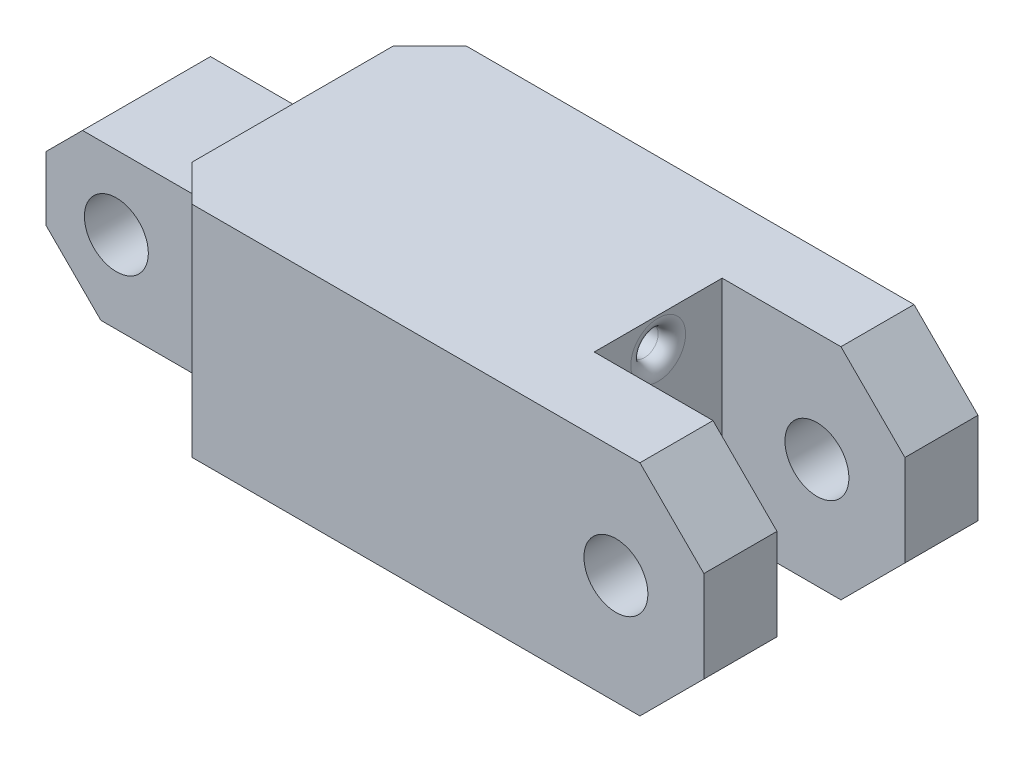
ISO-10303-21;
HEADER;
FILE_DESCRIPTION(('STEP AP214'),'2;1');
FILE_NAME('part.step','',(''),(''),'','','');
FILE_SCHEMA(('AUTOMOTIVE_DESIGN { 1 0 10303 214 1 1 1 1 }'));
ENDSEC;
DATA;
#1=APPLICATION_CONTEXT('core data for automotive mechanical design processes');
#2=APPLICATION_PROTOCOL_DEFINITION('international standard','automotive_design',2000,#1);
#3=PRODUCT_CONTEXT('',#1,'mechanical');
#4=PRODUCT('Part','Part','',(#3));
#5=PRODUCT_RELATED_PRODUCT_CATEGORY('part','',(#4));
#6=PRODUCT_DEFINITION_FORMATION('','',#4);
#7=PRODUCT_DEFINITION_CONTEXT('part definition',#1,'design');
#8=PRODUCT_DEFINITION('design','',#6,#7);
#9=PRODUCT_DEFINITION_SHAPE('','',#8);
#10=(LENGTH_UNIT() NAMED_UNIT(*) SI_UNIT(.MILLI.,.METRE.));
#11=(NAMED_UNIT(*) PLANE_ANGLE_UNIT() SI_UNIT($,.RADIAN.));
#12=(NAMED_UNIT(*) SI_UNIT($,.STERADIAN.) SOLID_ANGLE_UNIT());
#13=UNCERTAINTY_MEASURE_WITH_UNIT(LENGTH_MEASURE(1.E-05),#10,'distance_accuracy_value','');
#14=(GEOMETRIC_REPRESENTATION_CONTEXT(3) GLOBAL_UNCERTAINTY_ASSIGNED_CONTEXT((#13)) GLOBAL_UNIT_ASSIGNED_CONTEXT((#10,
#11,#12)) REPRESENTATION_CONTEXT('',''));
#15=CARTESIAN_POINT('',(0.,0.,0.));
#16=DIRECTION('',(0.,0.,1.));
#17=DIRECTION('',(1.,0.,0.));
#18=AXIS2_PLACEMENT_3D('',#15,#16,#17);
#19=CARTESIAN_POINT('',(40.,6.,7.5));
#20=DIRECTION('',(0.,-1.,0.));
#21=DIRECTION('',(0.,0.,-1.));
#22=AXIS2_PLACEMENT_3D('',#19,#20,#21);
#23=PLANE('',#22);
#24=DIRECTION('',(-1.,0.,0.));
#25=VECTOR('',#24,1.);
#26=CARTESIAN_POINT('',(40.,6.,-7.5));
#27=LINE('',#26,#25);
#28=CARTESIAN_POINT('',(36.5,6.,-7.5));
#29=VERTEX_POINT('',#28);
#30=CARTESIAN_POINT('',(12.,6.,-7.5));
#31=VERTEX_POINT('',#30);
#32=EDGE_CURVE('E216',#29,#31,#27,.T.);
#33=ORIENTED_EDGE('',*,*,#32,.T.);
#34=DIRECTION('',(0.707106781186547,0.,-0.707106781186548));
#35=VECTOR('',#34,1.);
#36=CARTESIAN_POINT('',(12.,6.,-7.5));
#37=LINE('',#36,#35);
#38=CARTESIAN_POINT('',(10.,6.,-5.49999999999999));
#39=VERTEX_POINT('',#38);
#40=EDGE_CURVE('E305',#31,#39,#37,.F.);
#41=ORIENTED_EDGE('',*,*,#40,.T.);
#42=DIRECTION('',(0.,0.,-1.));
#43=VECTOR('',#42,1.);
#44=CARTESIAN_POINT('',(10.,6.,-9.96125126915484));
#45=LINE('',#44,#43);
#46=CARTESIAN_POINT('',(10.,6.,5.49999999999999));
#47=VERTEX_POINT('',#46);
#48=EDGE_CURVE('E203',#47,#39,#45,.T.);
#49=ORIENTED_EDGE('',*,*,#48,.F.);
#50=DIRECTION('',(-0.707106781186546,0.,-0.707106781186549));
#51=VECTOR('',#50,1.);
#52=CARTESIAN_POINT('',(12.,6.,7.5));
#53=LINE('',#52,#51);
#54=CARTESIAN_POINT('',(12.,6.,7.5));
#55=VERTEX_POINT('',#54);
#56=EDGE_CURVE('E303',#47,#55,#53,.F.);
#57=ORIENTED_EDGE('',*,*,#56,.T.);
#58=DIRECTION('',(-1.,0.,0.));
#59=VECTOR('',#58,1.);
#60=CARTESIAN_POINT('',(40.,6.,7.5));
#61=LINE('',#60,#59);
#62=CARTESIAN_POINT('',(36.5,6.,7.5));
#63=VERTEX_POINT('',#62);
#64=EDGE_CURVE('E213',#63,#55,#61,.T.);
#65=ORIENTED_EDGE('',*,*,#64,.F.);
#66=DIRECTION('',(0.,0.,-1.));
#67=VECTOR('',#66,1.);
#68=CARTESIAN_POINT('',(36.5,6.,3.5));
#69=LINE('',#68,#67);
#70=CARTESIAN_POINT('',(36.5,6.,3.5));
#71=VERTEX_POINT('',#70);
#72=EDGE_CURVE('E262',#63,#71,#69,.T.);
#73=ORIENTED_EDGE('',*,*,#72,.T.);
#74=DIRECTION('',(1.,0.,0.));
#75=VECTOR('',#74,1.);
#76=CARTESIAN_POINT('',(30.,6.,3.5));
#77=LINE('',#76,#75);
#78=CARTESIAN_POINT('',(30.,6.,3.5));
#79=VERTEX_POINT('',#78);
#80=EDGE_CURVE('E349',#79,#71,#77,.T.);
#81=ORIENTED_EDGE('',*,*,#80,.F.);
#82=DIRECTION('',(0.,0.,1.));
#83=VECTOR('',#82,1.);
#84=CARTESIAN_POINT('',(30.,6.,-3.50000000000001));
#85=LINE('',#84,#83);
#86=CARTESIAN_POINT('',(30.,6.,-3.50000000000001));
#87=VERTEX_POINT('',#86);
#88=EDGE_CURVE('E353',#87,#79,#85,.T.);
#89=ORIENTED_EDGE('',*,*,#88,.F.);
#90=DIRECTION('',(-1.,0.,0.));
#91=VECTOR('',#90,1.);
#92=CARTESIAN_POINT('',(30.,6.,-3.50000000000001));
#93=LINE('',#92,#91);
#94=CARTESIAN_POINT('',(36.5,6.,-3.50000000000002));
#95=VERTEX_POINT('',#94);
#96=EDGE_CURVE('E182',#95,#87,#93,.T.);
#97=ORIENTED_EDGE('',*,*,#96,.F.);
#98=DIRECTION('',(0.,0.,-1.));
#99=VECTOR('',#98,1.);
#100=CARTESIAN_POINT('',(36.5,6.,-7.5));
#101=LINE('',#100,#99);
#102=EDGE_CURVE('E264',#95,#29,#101,.T.);
#103=ORIENTED_EDGE('',*,*,#102,.T.);
#104=EDGE_LOOP('',(#33,#41,#49,#57,#65,#73,#81,#89,#97,#103));
#105=FACE_BOUND('',#104,.T.);
#106=ADVANCED_FACE('F31',(#105),#23,.F.);
#107=CARTESIAN_POINT('',(0.,4.35769332315772,0.));
#108=DIRECTION('',(1.,0.,0.));
#109=DIRECTION('',(0.,0.,-1.));
#110=AXIS2_PLACEMENT_3D('',#107,#108,#109);
#111=CYLINDRICAL_SURFACE('',#110,0.75);
#112=CARTESIAN_POINT('',(29.25,4.35769332315772,0.));
#113=DIRECTION('',(-1.,0.,0.));
#114=DIRECTION('',(0.,0.,1.));
#115=AXIS2_PLACEMENT_3D('',#112,#113,#114);
#116=CIRCLE('',#115,0.75);
#117=CARTESIAN_POINT('',(29.25,4.35769332315772,0.749999999999999));
#118=VERTEX_POINT('',#117);
#119=EDGE_CURVE('E291',#118,#118,#116,.F.);
#120=ORIENTED_EDGE('',*,*,#119,.T.);
#121=EDGE_LOOP('',(#120));
#122=FACE_BOUND('',#121,.T.);
#123=CARTESIAN_POINT('',(10.75,4.35769332315772,0.));
#124=DIRECTION('',(1.,0.,0.));
#125=DIRECTION('',(0.,0.,-1.));
#126=AXIS2_PLACEMENT_3D('',#123,#124,#125);
#127=CIRCLE('',#126,0.75);
#128=CARTESIAN_POINT('',(10.75,4.35769332315772,-0.750000000000001));
#129=VERTEX_POINT('',#128);
#130=EDGE_CURVE('E284',#129,#129,#127,.F.);
#131=ORIENTED_EDGE('',*,*,#130,.T.);
#132=EDGE_LOOP('',(#131));
#133=FACE_BOUND('',#132,.T.);
#134=ADVANCED_FACE('F446',(#122,#133),#111,.F.);
#135=CARTESIAN_POINT('',(40.,-6.,-7.5));
#136=DIRECTION('',(1.,0.,0.));
#137=DIRECTION('',(0.,0.,-1.));
#138=AXIS2_PLACEMENT_3D('',#135,#136,#137);
#139=PLANE('',#138);
#140=DIRECTION('',(0.,-1.,0.));
#141=VECTOR('',#140,1.);
#142=CARTESIAN_POINT('',(40.,6.,7.5));
#143=LINE('',#142,#141);
#144=CARTESIAN_POINT('',(40.,2.49999999999999,7.5));
#145=VERTEX_POINT('',#144);
#146=CARTESIAN_POINT('',(40.,-2.5,7.5));
#147=VERTEX_POINT('',#146);
#148=EDGE_CURVE('E198',#145,#147,#143,.T.);
#149=ORIENTED_EDGE('',*,*,#148,.T.);
#150=DIRECTION('',(0.,0.,-1.));
#151=VECTOR('',#150,1.);
#152=CARTESIAN_POINT('',(40.,-2.5,3.5));
#153=LINE('',#152,#151);
#154=CARTESIAN_POINT('',(40.,-2.5,3.5));
#155=VERTEX_POINT('',#154);
#156=EDGE_CURVE('E251',#147,#155,#153,.T.);
#157=ORIENTED_EDGE('',*,*,#156,.T.);
#158=DIRECTION('',(0.,-1.,0.));
#159=VECTOR('',#158,1.);
#160=CARTESIAN_POINT('',(40.,-6.,3.5));
#161=LINE('',#160,#159);
#162=CARTESIAN_POINT('',(40.,2.49999999999999,3.5));
#163=VERTEX_POINT('',#162);
#164=EDGE_CURVE('E227',#163,#155,#161,.T.);
#165=ORIENTED_EDGE('',*,*,#164,.F.);
#166=DIRECTION('',(0.,0.,1.));
#167=VECTOR('',#166,1.);
#168=CARTESIAN_POINT('',(40.,2.49999999999999,7.5));
#169=LINE('',#168,#167);
#170=EDGE_CURVE('E248',#163,#145,#169,.T.);
#171=ORIENTED_EDGE('',*,*,#170,.T.);
#172=EDGE_LOOP('',(#149,#157,#165,#171));
#173=FACE_BOUND('',#172,.T.);
#174=ADVANCED_FACE('F416',(#173),#139,.T.);
#175=CARTESIAN_POINT('',(40.,6.,-7.5));
#176=DIRECTION('',(0.,0.,1.));
#177=DIRECTION('',(0.,-1.,0.));
#178=AXIS2_PLACEMENT_3D('',#175,#176,#177);
#179=PLANE('',#178);
#180=CARTESIAN_POINT('',(35.1857246316315,0.,-7.5));
#181=DIRECTION('',(0.,0.,1.));
#182=DIRECTION('',(1.,0.,0.));
#183=AXIS2_PLACEMENT_3D('',#180,#181,#182);
#184=CIRCLE('',#183,1.75);
#185=CARTESIAN_POINT('',(36.9357246316315,0.,-7.5));
#186=VERTEX_POINT('',#185);
#187=EDGE_CURVE('E288',#186,#186,#184,.T.);
#188=ORIENTED_EDGE('',*,*,#187,.T.);
#189=EDGE_LOOP('',(#188));
#190=FACE_BOUND('',#189,.T.);
#191=DIRECTION('',(-1.,0.,0.));
#192=VECTOR('',#191,1.);
#193=CARTESIAN_POINT('',(40.,-6.,-7.5));
#194=LINE('',#193,#192);
#195=CARTESIAN_POINT('',(36.5,-6.,-7.5));
#196=VERTEX_POINT('',#195);
#197=CARTESIAN_POINT('',(12.,-6.,-7.50000000000001));
#198=VERTEX_POINT('',#197);
#199=EDGE_CURVE('E207',#196,#198,#194,.T.);
#200=ORIENTED_EDGE('',*,*,#199,.T.);
#201=DIRECTION('',(0.,1.,0.));
#202=VECTOR('',#201,1.);
#203=CARTESIAN_POINT('',(12.,6.,-7.5));
#204=LINE('',#203,#202);
#205=EDGE_CURVE('E300',#198,#31,#204,.T.);
#206=ORIENTED_EDGE('',*,*,#205,.T.);
#207=ORIENTED_EDGE('',*,*,#32,.F.);
#208=DIRECTION('',(0.707106781186548,-0.707106781186547,0.));
#209=VECTOR('',#208,1.);
#210=CARTESIAN_POINT('',(40.,2.49999999999999,-7.5));
#211=LINE('',#210,#209);
#212=CARTESIAN_POINT('',(40.,2.49999999999999,-7.5));
#213=VERTEX_POINT('',#212);
#214=EDGE_CURVE('E236',#29,#213,#211,.T.);
#215=ORIENTED_EDGE('',*,*,#214,.T.);
#216=DIRECTION('',(0.,1.,0.));
#217=VECTOR('',#216,1.);
#218=CARTESIAN_POINT('',(40.,6.,-7.5));
#219=LINE('',#218,#217);
#220=CARTESIAN_POINT('',(40.,-2.5,-7.5));
#221=VERTEX_POINT('',#220);
#222=EDGE_CURVE('E195',#221,#213,#219,.T.);
#223=ORIENTED_EDGE('',*,*,#222,.F.);
#224=DIRECTION('',(-0.707106781186548,-0.707106781186547,0.));
#225=VECTOR('',#224,1.);
#226=CARTESIAN_POINT('',(40.,-2.5,-7.5));
#227=LINE('',#226,#225);
#228=EDGE_CURVE('E238',#221,#196,#227,.T.);
#229=ORIENTED_EDGE('',*,*,#228,.T.);
#230=EDGE_LOOP('',(#200,#206,#207,#215,#223,#229));
#231=FACE_BOUND('',#230,.T.);
#232=ADVANCED_FACE('F318',(#190,#231),#179,.F.);
#233=CARTESIAN_POINT('',(40.,6.,7.5));
#234=DIRECTION('',(0.,0.,-1.));
#235=DIRECTION('',(0.,1.,0.));
#236=AXIS2_PLACEMENT_3D('',#233,#234,#235);
#237=PLANE('',#236);
#238=CARTESIAN_POINT('',(35.1857246316315,0.,7.5));
#239=DIRECTION('',(0.,0.,1.));
#240=DIRECTION('',(1.,0.,0.));
#241=AXIS2_PLACEMENT_3D('',#238,#239,#240);
#242=CIRCLE('',#241,1.75);
#243=CARTESIAN_POINT('',(36.9357246316315,0.,7.5));
#244=VERTEX_POINT('',#243);
#245=EDGE_CURVE('E365',#244,#244,#242,.T.);
#246=ORIENTED_EDGE('',*,*,#245,.F.);
#247=EDGE_LOOP('',(#246));
#248=FACE_BOUND('',#247,.T.);
#249=ORIENTED_EDGE('',*,*,#64,.T.);
#250=DIRECTION('',(0.,-1.,0.));
#251=VECTOR('',#250,1.);
#252=CARTESIAN_POINT('',(12.,6.,7.5));
#253=LINE('',#252,#251);
#254=CARTESIAN_POINT('',(12.,-6.,7.5));
#255=VERTEX_POINT('',#254);
#256=EDGE_CURVE('E11',#55,#255,#253,.T.);
#257=ORIENTED_EDGE('',*,*,#256,.T.);
#258=DIRECTION('',(-1.,0.,0.));
#259=VECTOR('',#258,1.);
#260=CARTESIAN_POINT('',(40.,-6.,7.5));
#261=LINE('',#260,#259);
#262=CARTESIAN_POINT('',(36.5,-6.,7.5));
#263=VERTEX_POINT('',#262);
#264=EDGE_CURVE('E210',#263,#255,#261,.T.);
#265=ORIENTED_EDGE('',*,*,#264,.F.);
#266=DIRECTION('',(0.707106781186548,0.707106781186547,0.));
#267=VECTOR('',#266,1.);
#268=CARTESIAN_POINT('',(40.,-2.5,7.5));
#269=LINE('',#268,#267);
#270=EDGE_CURVE('E260',#263,#147,#269,.T.);
#271=ORIENTED_EDGE('',*,*,#270,.T.);
#272=ORIENTED_EDGE('',*,*,#148,.F.);
#273=DIRECTION('',(-0.707106781186548,0.707106781186547,0.));
#274=VECTOR('',#273,1.);
#275=CARTESIAN_POINT('',(40.,2.49999999999999,7.5));
#276=LINE('',#275,#274);
#277=EDGE_CURVE('E258',#145,#63,#276,.T.);
#278=ORIENTED_EDGE('',*,*,#277,.T.);
#279=EDGE_LOOP('',(#249,#257,#265,#271,#272,#278));
#280=FACE_BOUND('',#279,.T.);
#281=ADVANCED_FACE('F414',(#248,#280),#237,.F.);
#282=CARTESIAN_POINT('',(40.,-6.,7.5));
#283=DIRECTION('',(0.,1.,0.));
#284=DIRECTION('',(0.,0.,1.));
#285=AXIS2_PLACEMENT_3D('',#282,#283,#284);
#286=PLANE('',#285);
#287=DIRECTION('',(0.,0.,-1.));
#288=VECTOR('',#287,1.);
#289=CARTESIAN_POINT('',(10.,-6.,-9.96125126915484));
#290=LINE('',#289,#288);
#291=CARTESIAN_POINT('',(10.,-6.,-3.5));
#292=VERTEX_POINT('',#291);
#293=CARTESIAN_POINT('',(10.,-6.,-5.49999999999999));
#294=VERTEX_POINT('',#293);
#295=EDGE_CURVE('E194',#292,#294,#290,.T.);
#296=ORIENTED_EDGE('',*,*,#295,.T.);
#297=DIRECTION('',(-0.707106781186547,0.,0.707106781186548));
#298=VECTOR('',#297,1.);
#299=CARTESIAN_POINT('',(12.,-6.,-7.5));
#300=LINE('',#299,#298);
#301=EDGE_CURVE('E39',#294,#198,#300,.F.);
#302=ORIENTED_EDGE('',*,*,#301,.T.);
#303=ORIENTED_EDGE('',*,*,#199,.F.);
#304=DIRECTION('',(0.,0.,1.));
#305=VECTOR('',#304,1.);
#306=CARTESIAN_POINT('',(36.5,-6.,-3.50000000000002));
#307=LINE('',#306,#305);
#308=CARTESIAN_POINT('',(36.5,-6.,-3.50000000000002));
#309=VERTEX_POINT('',#308);
#310=EDGE_CURVE('E242',#196,#309,#307,.T.);
#311=ORIENTED_EDGE('',*,*,#310,.T.);
#312=DIRECTION('',(-1.,0.,0.));
#313=VECTOR('',#312,1.);
#314=CARTESIAN_POINT('',(30.,-6.,-3.50000000000001));
#315=LINE('',#314,#313);
#316=CARTESIAN_POINT('',(30.,-6.,-3.50000000000001));
#317=VERTEX_POINT('',#316);
#318=EDGE_CURVE('E352',#309,#317,#315,.T.);
#319=ORIENTED_EDGE('',*,*,#318,.T.);
#320=DIRECTION('',(0.,0.,1.));
#321=VECTOR('',#320,1.);
#322=CARTESIAN_POINT('',(30.,-6.,-3.50000000000001));
#323=LINE('',#322,#321);
#324=CARTESIAN_POINT('',(30.,-6.,3.5));
#325=VERTEX_POINT('',#324);
#326=EDGE_CURVE('E359',#317,#325,#323,.T.);
#327=ORIENTED_EDGE('',*,*,#326,.T.);
#328=DIRECTION('',(1.,0.,0.));
#329=VECTOR('',#328,1.);
#330=CARTESIAN_POINT('',(30.,-6.,3.5));
#331=LINE('',#330,#329);
#332=CARTESIAN_POINT('',(36.5,-6.,3.5));
#333=VERTEX_POINT('',#332);
#334=EDGE_CURVE('E347',#325,#333,#331,.T.);
#335=ORIENTED_EDGE('',*,*,#334,.T.);
#336=DIRECTION('',(0.,0.,1.));
#337=VECTOR('',#336,1.);
#338=CARTESIAN_POINT('',(36.5,-6.,7.5));
#339=LINE('',#338,#337);
#340=EDGE_CURVE('E240',#333,#263,#339,.T.);
#341=ORIENTED_EDGE('',*,*,#340,.T.);
#342=ORIENTED_EDGE('',*,*,#264,.T.);
#343=DIRECTION('',(0.707106781186546,0.,0.707106781186549));
#344=VECTOR('',#343,1.);
#345=CARTESIAN_POINT('',(12.,-6.,7.5));
#346=LINE('',#345,#344);
#347=CARTESIAN_POINT('',(10.,-6.,5.49999999999999));
#348=VERTEX_POINT('',#347);
#349=EDGE_CURVE('E46',#255,#348,#346,.F.);
#350=ORIENTED_EDGE('',*,*,#349,.T.);
#351=DIRECTION('',(0.,0.,-1.));
#352=VECTOR('',#351,1.);
#353=CARTESIAN_POINT('',(10.,-6.,9.96125126915484));
#354=LINE('',#353,#352);
#355=CARTESIAN_POINT('',(10.,-6.,3.5));
#356=VERTEX_POINT('',#355);
#357=EDGE_CURVE('E333',#348,#356,#354,.T.);
#358=ORIENTED_EDGE('',*,*,#357,.T.);
#359=DIRECTION('',(-1.,0.,0.));
#360=VECTOR('',#359,1.);
#361=CARTESIAN_POINT('',(-3.34504973201027,-6.,3.5));
#362=LINE('',#361,#360);
#363=CARTESIAN_POINT('',(3.00000000000001,-6.,3.5));
#364=VERTEX_POINT('',#363);
#365=EDGE_CURVE('E328',#356,#364,#362,.T.);
#366=ORIENTED_EDGE('',*,*,#365,.T.);
#367=DIRECTION('',(0.,0.,-1.));
#368=VECTOR('',#367,1.);
#369=CARTESIAN_POINT('',(3.00000000000001,-6.,7.5));
#370=LINE('',#369,#368);
#371=CARTESIAN_POINT('',(3.00000000000001,-6.,-3.5));
#372=VERTEX_POINT('',#371);
#373=EDGE_CURVE('E266',#364,#372,#370,.T.);
#374=ORIENTED_EDGE('',*,*,#373,.T.);
#375=DIRECTION('',(1.,0.,0.));
#376=VECTOR('',#375,1.);
#377=CARTESIAN_POINT('',(-3.34504973201027,-6.,-3.5));
#378=LINE('',#377,#376);
#379=EDGE_CURVE('E200',#372,#292,#378,.T.);
#380=ORIENTED_EDGE('',*,*,#379,.T.);
#381=EDGE_LOOP('',(#296,#302,#303,#311,#319,#327,#335,#341,#342,#350,#358,#366,#374,#380));
#382=FACE_BOUND('',#381,.T.);
#383=ADVANCED_FACE('F313',(#382),#286,.F.);
#384=DIRECTION('',(0.,1.,0.));
#385=VECTOR('',#384,1.);
#386=CARTESIAN_POINT('',(40.,-6.,-3.50000000000002));
#387=LINE('',#386,#385);
#388=CARTESIAN_POINT('',(40.,-2.5,-3.50000000000002));
#389=VERTEX_POINT('',#388);
#390=CARTESIAN_POINT('',(40.,2.49999999999999,-3.50000000000002));
#391=VERTEX_POINT('',#390);
#392=EDGE_CURVE('E224',#389,#391,#387,.T.);
#393=ORIENTED_EDGE('',*,*,#392,.F.);
#394=DIRECTION('',(0.,0.,-1.));
#395=VECTOR('',#394,1.);
#396=CARTESIAN_POINT('',(40.,-2.5,-7.5));
#397=LINE('',#396,#395);
#398=EDGE_CURVE('E233',#389,#221,#397,.T.);
#399=ORIENTED_EDGE('',*,*,#398,.T.);
#400=ORIENTED_EDGE('',*,*,#222,.T.);
#401=DIRECTION('',(0.,0.,1.));
#402=VECTOR('',#401,1.);
#403=CARTESIAN_POINT('',(40.,2.49999999999999,-3.50000000000002));
#404=LINE('',#403,#402);
#405=EDGE_CURVE('E230',#213,#391,#404,.T.);
#406=ORIENTED_EDGE('',*,*,#405,.T.);
#407=EDGE_LOOP('',(#393,#399,#400,#406));
#408=FACE_BOUND('',#407,.T.);
#409=ADVANCED_FACE('F394',(#408),#139,.T.);
#410=CARTESIAN_POINT('',(0.,-6.,-7.5));
#411=DIRECTION('',(1.,0.,0.));
#412=DIRECTION('',(0.,0.,-1.));
#413=AXIS2_PLACEMENT_3D('',#410,#411,#412);
#414=PLANE('',#413);
#415=DIRECTION('',(0.,1.,0.));
#416=VECTOR('',#415,1.);
#417=CARTESIAN_POINT('',(0.,-6.,3.5));
#418=LINE('',#417,#416);
#419=CARTESIAN_POINT('',(0.,-2.99999999999999,3.5));
#420=VERTEX_POINT('',#419);
#421=CARTESIAN_POINT('',(0.,0.499999999999989,3.5));
#422=VERTEX_POINT('',#421);
#423=EDGE_CURVE('E221',#420,#422,#418,.T.);
#424=ORIENTED_EDGE('',*,*,#423,.T.);
#425=DIRECTION('',(0.,0.,-1.));
#426=VECTOR('',#425,1.);
#427=CARTESIAN_POINT('',(0.,0.49999999999999,-7.5));
#428=LINE('',#427,#426);
#429=CARTESIAN_POINT('',(0.,0.499999999999988,-3.5));
#430=VERTEX_POINT('',#429);
#431=EDGE_CURVE('E281',#422,#430,#428,.T.);
#432=ORIENTED_EDGE('',*,*,#431,.T.);
#433=DIRECTION('',(0.,-1.,0.));
#434=VECTOR('',#433,1.);
#435=CARTESIAN_POINT('',(0.,-6.,-3.5));
#436=LINE('',#435,#434);
#437=CARTESIAN_POINT('',(0.,-2.99999999999998,-3.5));
#438=VERTEX_POINT('',#437);
#439=EDGE_CURVE('E219',#430,#438,#436,.T.);
#440=ORIENTED_EDGE('',*,*,#439,.T.);
#441=DIRECTION('',(0.,0.,1.));
#442=VECTOR('',#441,1.);
#443=CARTESIAN_POINT('',(0.,-2.99999999999998,-7.5));
#444=LINE('',#443,#442);
#445=EDGE_CURVE('E272',#438,#420,#444,.T.);
#446=ORIENTED_EDGE('',*,*,#445,.T.);
#447=EDGE_LOOP('',(#424,#432,#440,#446));
#448=FACE_BOUND('',#447,.T.);
#449=ADVANCED_FACE('F434',(#448),#414,.F.);
#450=CARTESIAN_POINT('',(10.,-6.,-9.96125126915484));
#451=DIRECTION('',(1.,0.,0.));
#452=DIRECTION('',(0.,0.,-1.));
#453=AXIS2_PLACEMENT_3D('',#450,#451,#452);
#454=PLANE('',#453);
#455=CARTESIAN_POINT('',(10.,4.35769332315772,0.));
#456=DIRECTION('',(1.,0.,0.));
#457=DIRECTION('',(0.,0.,-1.));
#458=AXIS2_PLACEMENT_3D('',#455,#456,#457);
#459=CIRCLE('',#458,1.5);
#460=CARTESIAN_POINT('',(10.,4.35769332315772,-1.5));
#461=VERTEX_POINT('',#460);
#462=EDGE_CURVE('E297',#461,#461,#459,.T.);
#463=ORIENTED_EDGE('',*,*,#462,.T.);
#464=EDGE_LOOP('',(#463));
#465=FACE_BOUND('',#464,.T.);
#466=ORIENTED_EDGE('',*,*,#48,.T.);
#467=DIRECTION('',(0.,-1.,0.));
#468=VECTOR('',#467,1.);
#469=CARTESIAN_POINT('',(10.,-6.,-5.49999999999999));
#470=LINE('',#469,#468);
#471=EDGE_CURVE('E53',#39,#294,#470,.T.);
#472=ORIENTED_EDGE('',*,*,#471,.T.);
#473=ORIENTED_EDGE('',*,*,#295,.F.);
#474=DIRECTION('',(0.,1.,0.));
#475=VECTOR('',#474,1.);
#476=CARTESIAN_POINT('',(10.,-6.,-3.5));
#477=LINE('',#476,#475);
#478=CARTESIAN_POINT('',(10.,2.5,-3.5));
#479=VERTEX_POINT('',#478);
#480=EDGE_CURVE('E176',#292,#479,#477,.T.);
#481=ORIENTED_EDGE('',*,*,#480,.T.);
#482=DIRECTION('',(0.,0.,1.));
#483=VECTOR('',#482,1.);
#484=CARTESIAN_POINT('',(10.,2.5,-11.3987409239087));
#485=LINE('',#484,#483);
#486=CARTESIAN_POINT('',(10.,2.5,3.5));
#487=VERTEX_POINT('',#486);
#488=EDGE_CURVE('E183',#479,#487,#485,.T.);
#489=ORIENTED_EDGE('',*,*,#488,.T.);
#490=DIRECTION('',(0.,1.,0.));
#491=VECTOR('',#490,1.);
#492=CARTESIAN_POINT('',(10.,-6.,3.5));
#493=LINE('',#492,#491);
#494=EDGE_CURVE('E326',#356,#487,#493,.T.);
#495=ORIENTED_EDGE('',*,*,#494,.F.);
#496=ORIENTED_EDGE('',*,*,#357,.F.);
#497=DIRECTION('',(0.,1.,0.));
#498=VECTOR('',#497,1.);
#499=CARTESIAN_POINT('',(10.,-6.,5.49999999999999));
#500=LINE('',#499,#498);
#501=EDGE_CURVE('E307',#348,#47,#500,.T.);
#502=ORIENTED_EDGE('',*,*,#501,.T.);
#503=EDGE_LOOP('',(#466,#472,#473,#481,#489,#495,#496,#502));
#504=FACE_BOUND('',#503,.T.);
#505=ADVANCED_FACE('F193',(#465,#504),#454,.F.);
#506=CARTESIAN_POINT('',(-3.34504973201027,-6.,-3.5));
#507=DIRECTION('',(0.,0.,1.));
#508=DIRECTION('',(1.,0.,0.));
#509=AXIS2_PLACEMENT_3D('',#506,#507,#508);
#510=PLANE('',#509);
#511=CARTESIAN_POINT('',(3.8499044329728,-1.52090778163064,-3.5));
#512=DIRECTION('',(0.,0.,1.));
#513=DIRECTION('',(1.,0.,0.));
#514=AXIS2_PLACEMENT_3D('',#511,#512,#513);
#515=CIRCLE('',#514,1.75);
#516=CARTESIAN_POINT('',(5.5999044329728,-1.52090778163064,-3.5));
#517=VERTEX_POINT('',#516);
#518=EDGE_CURVE('E337',#517,#517,#515,.T.);
#519=ORIENTED_EDGE('',*,*,#518,.T.);
#520=EDGE_LOOP('',(#519));
#521=FACE_BOUND('',#520,.T.);
#522=ORIENTED_EDGE('',*,*,#439,.F.);
#523=DIRECTION('',(-0.707106781186546,-0.707106781186549,0.));
#524=VECTOR('',#523,1.);
#525=CARTESIAN_POINT('',(2.,2.5,-3.5));
#526=LINE('',#525,#524);
#527=CARTESIAN_POINT('',(2.,2.5,-3.5));
#528=VERTEX_POINT('',#527);
#529=EDGE_CURVE('E178',#430,#528,#526,.F.);
#530=ORIENTED_EDGE('',*,*,#529,.T.);
#531=DIRECTION('',(1.,0.,0.));
#532=VECTOR('',#531,1.);
#533=CARTESIAN_POINT('',(-3.34504973201027,2.5,-3.5));
#534=LINE('',#533,#532);
#535=EDGE_CURVE('E170',#528,#479,#534,.T.);
#536=ORIENTED_EDGE('',*,*,#535,.T.);
#537=ORIENTED_EDGE('',*,*,#480,.F.);
#538=ORIENTED_EDGE('',*,*,#379,.F.);
#539=DIRECTION('',(0.707106781186547,-0.707106781186548,0.));
#540=VECTOR('',#539,1.);
#541=CARTESIAN_POINT('',(3.00000000000001,-6.,-3.5));
#542=LINE('',#541,#540);
#543=EDGE_CURVE('E269',#372,#438,#542,.F.);
#544=ORIENTED_EDGE('',*,*,#543,.T.);
#545=EDGE_LOOP('',(#522,#530,#536,#537,#538,#544));
#546=FACE_BOUND('',#545,.T.);
#547=ADVANCED_FACE('F173',(#521,#546),#510,.F.);
#548=CARTESIAN_POINT('',(-3.34504973201027,-6.,3.5));
#549=DIRECTION('',(0.,0.,-1.));
#550=DIRECTION('',(-1.,0.,0.));
#551=AXIS2_PLACEMENT_3D('',#548,#549,#550);
#552=PLANE('',#551);
#553=CARTESIAN_POINT('',(3.8499044329728,-1.52090778163064,3.5));
#554=DIRECTION('',(0.,0.,1.));
#555=DIRECTION('',(1.,0.,0.));
#556=AXIS2_PLACEMENT_3D('',#553,#554,#555);
#557=CIRCLE('',#556,1.75);
#558=CARTESIAN_POINT('',(5.5999044329728,-1.52090778163064,3.5));
#559=VERTEX_POINT('',#558);
#560=EDGE_CURVE('E340',#559,#559,#557,.T.);
#561=ORIENTED_EDGE('',*,*,#560,.F.);
#562=EDGE_LOOP('',(#561));
#563=FACE_BOUND('',#562,.T.);
#564=DIRECTION('',(-1.,0.,0.));
#565=VECTOR('',#564,1.);
#566=CARTESIAN_POINT('',(-3.34504973201027,2.5,3.5));
#567=LINE('',#566,#565);
#568=CARTESIAN_POINT('',(2.,2.5,3.5));
#569=VERTEX_POINT('',#568);
#570=EDGE_CURVE('E188',#487,#569,#567,.T.);
#571=ORIENTED_EDGE('',*,*,#570,.T.);
#572=DIRECTION('',(0.707106781186546,0.707106781186549,0.));
#573=VECTOR('',#572,1.);
#574=CARTESIAN_POINT('',(2.,2.5,3.5));
#575=LINE('',#574,#573);
#576=EDGE_CURVE('E279',#569,#422,#575,.F.);
#577=ORIENTED_EDGE('',*,*,#576,.T.);
#578=ORIENTED_EDGE('',*,*,#423,.F.);
#579=DIRECTION('',(-0.707106781186547,0.707106781186548,0.));
#580=VECTOR('',#579,1.);
#581=CARTESIAN_POINT('',(3.00000000000001,-6.,3.5));
#582=LINE('',#581,#580);
#583=EDGE_CURVE('E274',#420,#364,#582,.F.);
#584=ORIENTED_EDGE('',*,*,#583,.T.);
#585=ORIENTED_EDGE('',*,*,#365,.F.);
#586=ORIENTED_EDGE('',*,*,#494,.T.);
#587=EDGE_LOOP('',(#571,#577,#578,#584,#585,#586));
#588=FACE_BOUND('',#587,.T.);
#589=ADVANCED_FACE('F424',(#563,#588),#552,.F.);
#590=CARTESIAN_POINT('',(3.8499044329728,-1.52090778163064,-7.5));
#591=DIRECTION('',(0.,0.,1.));
#592=DIRECTION('',(1.,0.,0.));
#593=AXIS2_PLACEMENT_3D('',#590,#591,#592);
#594=CYLINDRICAL_SURFACE('',#593,1.75);
#595=ORIENTED_EDGE('',*,*,#560,.T.);
#596=EDGE_LOOP('',(#595));
#597=FACE_BOUND('',#596,.T.);
#598=ORIENTED_EDGE('',*,*,#518,.F.);
#599=EDGE_LOOP('',(#598));
#600=FACE_BOUND('',#599,.T.);
#601=ADVANCED_FACE('F582',(#597,#600),#594,.F.);
#602=CARTESIAN_POINT('',(30.,-6.,3.5));
#603=DIRECTION('',(0.,0.,1.));
#604=DIRECTION('',(1.,0.,0.));
#605=AXIS2_PLACEMENT_3D('',#602,#603,#604);
#606=PLANE('',#605);
#607=CARTESIAN_POINT('',(35.1857246316315,0.,3.5));
#608=DIRECTION('',(0.,0.,1.));
#609=DIRECTION('',(1.,0.,0.));
#610=AXIS2_PLACEMENT_3D('',#607,#608,#609);
#611=CIRCLE('',#610,1.75);
#612=CARTESIAN_POINT('',(36.9357246316315,0.,3.5));
#613=VERTEX_POINT('',#612);
#614=EDGE_CURVE('E191',#613,#613,#611,.T.);
#615=ORIENTED_EDGE('',*,*,#614,.T.);
#616=EDGE_LOOP('',(#615));
#617=FACE_BOUND('',#616,.T.);
#618=ORIENTED_EDGE('',*,*,#164,.T.);
#619=DIRECTION('',(-0.707106781186548,-0.707106781186547,0.));
#620=VECTOR('',#619,1.);
#621=CARTESIAN_POINT('',(40.,-2.5,3.5));
#622=LINE('',#621,#620);
#623=EDGE_CURVE('E256',#155,#333,#622,.T.);
#624=ORIENTED_EDGE('',*,*,#623,.T.);
#625=ORIENTED_EDGE('',*,*,#334,.F.);
#626=DIRECTION('',(0.,1.,0.));
#627=VECTOR('',#626,1.);
#628=CARTESIAN_POINT('',(30.,-6.,3.5));
#629=LINE('',#628,#627);
#630=EDGE_CURVE('E343',#325,#79,#629,.T.);
#631=ORIENTED_EDGE('',*,*,#630,.T.);
#632=ORIENTED_EDGE('',*,*,#80,.T.);
#633=DIRECTION('',(0.707106781186548,-0.707106781186547,0.));
#634=VECTOR('',#633,1.);
#635=CARTESIAN_POINT('',(40.,2.49999999999999,3.5));
#636=LINE('',#635,#634);
#637=EDGE_CURVE('E254',#71,#163,#636,.T.);
#638=ORIENTED_EDGE('',*,*,#637,.T.);
#639=EDGE_LOOP('',(#618,#624,#625,#631,#632,#638));
#640=FACE_BOUND('',#639,.T.);
#641=ADVANCED_FACE('F546',(#617,#640),#606,.F.);
#642=CARTESIAN_POINT('',(30.,-6.,-3.50000000000001));
#643=DIRECTION('',(-1.,0.,0.));
#644=DIRECTION('',(0.,0.,1.));
#645=AXIS2_PLACEMENT_3D('',#642,#643,#644);
#646=PLANE('',#645);
#647=CARTESIAN_POINT('',(30.,4.35769332315772,0.));
#648=DIRECTION('',(-1.,0.,0.));
#649=DIRECTION('',(0.,0.,1.));
#650=AXIS2_PLACEMENT_3D('',#647,#648,#649);
#651=CIRCLE('',#650,1.5);
#652=CARTESIAN_POINT('',(30.,4.35769332315772,1.5));
#653=VERTEX_POINT('',#652);
#654=EDGE_CURVE('E294',#653,#653,#651,.T.);
#655=ORIENTED_EDGE('',*,*,#654,.T.);
#656=EDGE_LOOP('',(#655));
#657=FACE_BOUND('',#656,.T.);
#658=ORIENTED_EDGE('',*,*,#88,.T.);
#659=ORIENTED_EDGE('',*,*,#630,.F.);
#660=ORIENTED_EDGE('',*,*,#326,.F.);
#661=DIRECTION('',(0.,1.,0.));
#662=VECTOR('',#661,1.);
#663=CARTESIAN_POINT('',(30.,-6.,-3.50000000000001));
#664=LINE('',#663,#662);
#665=EDGE_CURVE('E344',#317,#87,#664,.T.);
#666=ORIENTED_EDGE('',*,*,#665,.T.);
#667=EDGE_LOOP('',(#658,#659,#660,#666));
#668=FACE_BOUND('',#667,.T.);
#669=ADVANCED_FACE('F384',(#657,#668),#646,.F.);
#670=CARTESIAN_POINT('',(30.,-6.,-3.50000000000001));
#671=DIRECTION('',(0.,0.,-1.));
#672=DIRECTION('',(-1.,0.,0.));
#673=AXIS2_PLACEMENT_3D('',#670,#671,#672);
#674=PLANE('',#673);
#675=CARTESIAN_POINT('',(35.1857246316315,0.,-3.50000000000002));
#676=DIRECTION('',(0.,0.,-1.));
#677=DIRECTION('',(-1.,0.,0.));
#678=AXIS2_PLACEMENT_3D('',#675,#676,#677);
#679=CIRCLE('',#678,1.75);
#680=CARTESIAN_POINT('',(33.4357246316315,0.,-3.50000000000002));
#681=VERTEX_POINT('',#680);
#682=EDGE_CURVE('E285',#681,#681,#679,.T.);
#683=ORIENTED_EDGE('',*,*,#682,.T.);
#684=EDGE_LOOP('',(#683));
#685=FACE_BOUND('',#684,.T.);
#686=ORIENTED_EDGE('',*,*,#318,.F.);
#687=DIRECTION('',(0.707106781186548,0.707106781186547,0.));
#688=VECTOR('',#687,1.);
#689=CARTESIAN_POINT('',(40.,-2.5,-3.50000000000002));
#690=LINE('',#689,#688);
#691=EDGE_CURVE('E246',#309,#389,#690,.T.);
#692=ORIENTED_EDGE('',*,*,#691,.T.);
#693=ORIENTED_EDGE('',*,*,#392,.T.);
#694=DIRECTION('',(-0.707106781186548,0.707106781186547,0.));
#695=VECTOR('',#694,1.);
#696=CARTESIAN_POINT('',(40.,2.49999999999999,-3.50000000000002));
#697=LINE('',#696,#695);
#698=EDGE_CURVE('E244',#391,#95,#697,.T.);
#699=ORIENTED_EDGE('',*,*,#698,.T.);
#700=ORIENTED_EDGE('',*,*,#96,.T.);
#701=ORIENTED_EDGE('',*,*,#665,.F.);
#702=EDGE_LOOP('',(#686,#692,#693,#699,#700,#701));
#703=FACE_BOUND('',#702,.T.);
#704=ADVANCED_FACE('F380',(#685,#703),#674,.F.);
#705=CARTESIAN_POINT('',(40.,-2.5,-7.5));
#706=DIRECTION('',(0.707106781186547,-0.707106781186548,0.));
#707=DIRECTION('',(0.707106781186548,0.707106781186547,0.));
#708=AXIS2_PLACEMENT_3D('',#705,#706,#707);
#709=PLANE('',#708);
#710=ORIENTED_EDGE('',*,*,#691,.F.);
#711=ORIENTED_EDGE('',*,*,#310,.F.);
#712=ORIENTED_EDGE('',*,*,#228,.F.);
#713=ORIENTED_EDGE('',*,*,#398,.F.);
#714=EDGE_LOOP('',(#710,#711,#712,#713));
#715=FACE_BOUND('',#714,.T.);
#716=ADVANCED_FACE('F383',(#715),#709,.T.);
#717=CARTESIAN_POINT('',(40.,-2.5,-7.5));
#718=DIRECTION('',(0.707106781186547,-0.707106781186548,0.));
#719=DIRECTION('',(0.707106781186548,0.707106781186547,0.));
#720=AXIS2_PLACEMENT_3D('',#717,#718,#719);
#721=PLANE('',#720);
#722=ORIENTED_EDGE('',*,*,#270,.F.);
#723=ORIENTED_EDGE('',*,*,#340,.F.);
#724=ORIENTED_EDGE('',*,*,#623,.F.);
#725=ORIENTED_EDGE('',*,*,#156,.F.);
#726=EDGE_LOOP('',(#722,#723,#724,#725));
#727=FACE_BOUND('',#726,.T.);
#728=ADVANCED_FACE('F410',(#727),#721,.T.);
#729=CARTESIAN_POINT('',(40.,2.49999999999999,-7.5));
#730=DIRECTION('',(0.707106781186547,0.707106781186548,0.));
#731=DIRECTION('',(-0.707106781186548,0.707106781186547,0.));
#732=AXIS2_PLACEMENT_3D('',#729,#730,#731);
#733=PLANE('',#732);
#734=ORIENTED_EDGE('',*,*,#214,.F.);
#735=ORIENTED_EDGE('',*,*,#102,.F.);
#736=ORIENTED_EDGE('',*,*,#698,.F.);
#737=ORIENTED_EDGE('',*,*,#405,.F.);
#738=EDGE_LOOP('',(#734,#735,#736,#737));
#739=FACE_BOUND('',#738,.T.);
#740=ADVANCED_FACE('F399',(#739),#733,.T.);
#741=CARTESIAN_POINT('',(40.,2.49999999999999,-7.5));
#742=DIRECTION('',(0.707106781186547,0.707106781186548,0.));
#743=DIRECTION('',(-0.707106781186548,0.707106781186547,0.));
#744=AXIS2_PLACEMENT_3D('',#741,#742,#743);
#745=PLANE('',#744);
#746=ORIENTED_EDGE('',*,*,#637,.F.);
#747=ORIENTED_EDGE('',*,*,#72,.F.);
#748=ORIENTED_EDGE('',*,*,#277,.F.);
#749=ORIENTED_EDGE('',*,*,#170,.F.);
#750=EDGE_LOOP('',(#746,#747,#748,#749));
#751=FACE_BOUND('',#750,.T.);
#752=ADVANCED_FACE('F421',(#751),#745,.T.);
#753=CARTESIAN_POINT('',(3.00000000000001,-6.,7.5));
#754=DIRECTION('',(0.707106781186548,0.707106781186547,0.));
#755=DIRECTION('',(-0.707106781186547,0.707106781186548,0.));
#756=AXIS2_PLACEMENT_3D('',#753,#754,#755);
#757=PLANE('',#756);
#758=ORIENTED_EDGE('',*,*,#583,.F.);
#759=ORIENTED_EDGE('',*,*,#445,.F.);
#760=ORIENTED_EDGE('',*,*,#543,.F.);
#761=ORIENTED_EDGE('',*,*,#373,.F.);
#762=EDGE_LOOP('',(#758,#759,#760,#761));
#763=FACE_BOUND('',#762,.T.);
#764=ADVANCED_FACE('F429',(#763),#757,.F.);
#765=CARTESIAN_POINT('',(10.,2.5,-11.3987409239087));
#766=DIRECTION('',(0.,-1.,0.));
#767=DIRECTION('',(0.,0.,-1.));
#768=AXIS2_PLACEMENT_3D('',#765,#766,#767);
#769=PLANE('',#768);
#770=ORIENTED_EDGE('',*,*,#535,.F.);
#771=DIRECTION('',(0.,0.,1.));
#772=VECTOR('',#771,1.);
#773=CARTESIAN_POINT('',(2.,2.5,-11.3987409239087));
#774=LINE('',#773,#772);
#775=EDGE_CURVE('E277',#528,#569,#774,.T.);
#776=ORIENTED_EDGE('',*,*,#775,.T.);
#777=ORIENTED_EDGE('',*,*,#570,.F.);
#778=ORIENTED_EDGE('',*,*,#488,.F.);
#779=EDGE_LOOP('',(#770,#776,#777,#778));
#780=FACE_BOUND('',#779,.T.);
#781=ADVANCED_FACE('F186',(#780),#769,.F.);
#782=CARTESIAN_POINT('',(2.,2.5,-11.3987409239087));
#783=DIRECTION('',(0.707106781186549,-0.707106781186546,0.));
#784=DIRECTION('',(0.707106781186546,0.707106781186549,0.));
#785=AXIS2_PLACEMENT_3D('',#782,#783,#784);
#786=PLANE('',#785);
#787=ORIENTED_EDGE('',*,*,#529,.F.);
#788=ORIENTED_EDGE('',*,*,#431,.F.);
#789=ORIENTED_EDGE('',*,*,#576,.F.);
#790=ORIENTED_EDGE('',*,*,#775,.F.);
#791=EDGE_LOOP('',(#787,#788,#789,#790));
#792=FACE_BOUND('',#791,.T.);
#793=ADVANCED_FACE('F376',(#792),#786,.F.);
#794=CARTESIAN_POINT('',(35.1857246316315,0.,-7.5));
#795=DIRECTION('',(0.,0.,1.));
#796=DIRECTION('',(1.,0.,0.));
#797=AXIS2_PLACEMENT_3D('',#794,#795,#796);
#798=CYLINDRICAL_SURFACE('',#797,1.75);
#799=ORIENTED_EDGE('',*,*,#187,.F.);
#800=EDGE_LOOP('',(#799));
#801=FACE_BOUND('',#800,.T.);
#802=ORIENTED_EDGE('',*,*,#682,.F.);
#803=EDGE_LOOP('',(#802));
#804=FACE_BOUND('',#803,.T.);
#805=ADVANCED_FACE('F372',(#801,#804),#798,.F.);
#806=ORIENTED_EDGE('',*,*,#245,.T.);
#807=EDGE_LOOP('',(#806));
#808=FACE_BOUND('',#807,.T.);
#809=ORIENTED_EDGE('',*,*,#614,.F.);
#810=EDGE_LOOP('',(#809));
#811=FACE_BOUND('',#810,.T.);
#812=ADVANCED_FACE('F375',(#808,#811),#798,.F.);
#813=CARTESIAN_POINT('',(29.25,4.35769332315772,0.));
#814=DIRECTION('',(-1.,0.,0.));
#815=DIRECTION('',(0.,0.,1.));
#816=AXIS2_PLACEMENT_3D('',#813,#814,#815);
#817=TOROIDAL_SURFACE('',#816,1.5,0.75);
#818=ORIENTED_EDGE('',*,*,#654,.F.);
#819=EDGE_LOOP('',(#818));
#820=FACE_BOUND('',#819,.T.);
#821=ORIENTED_EDGE('',*,*,#119,.F.);
#822=EDGE_LOOP('',(#821));
#823=FACE_BOUND('',#822,.T.);
#824=ADVANCED_FACE('F469',(#820,#823),#817,.T.);
#825=CARTESIAN_POINT('',(10.75,4.35769332315772,0.));
#826=DIRECTION('',(1.,0.,0.));
#827=DIRECTION('',(0.,0.,-1.));
#828=AXIS2_PLACEMENT_3D('',#825,#826,#827);
#829=TOROIDAL_SURFACE('',#828,1.5,0.75);
#830=ORIENTED_EDGE('',*,*,#130,.F.);
#831=EDGE_LOOP('',(#830));
#832=FACE_BOUND('',#831,.T.);
#833=ORIENTED_EDGE('',*,*,#462,.F.);
#834=EDGE_LOOP('',(#833));
#835=FACE_BOUND('',#834,.T.);
#836=ADVANCED_FACE('F472',(#832,#835),#829,.T.);
#837=CARTESIAN_POINT('',(12.,6.,-7.5));
#838=DIRECTION('',(0.707106781186548,0.,0.707106781186547));
#839=DIRECTION('',(0.707106781186547,0.,-0.707106781186548));
#840=AXIS2_PLACEMENT_3D('',#837,#838,#839);
#841=PLANE('',#840);
#842=ORIENTED_EDGE('',*,*,#301,.F.);
#843=ORIENTED_EDGE('',*,*,#471,.F.);
#844=ORIENTED_EDGE('',*,*,#40,.F.);
#845=ORIENTED_EDGE('',*,*,#205,.F.);
#846=EDGE_LOOP('',(#842,#843,#844,#845));
#847=FACE_BOUND('',#846,.T.);
#848=ADVANCED_FACE('F321',(#847),#841,.F.);
#849=CARTESIAN_POINT('',(12.,6.,7.5));
#850=DIRECTION('',(0.707106781186549,0.,-0.707106781186546));
#851=DIRECTION('',(-0.707106781186546,0.,-0.707106781186549));
#852=AXIS2_PLACEMENT_3D('',#849,#850,#851);
#853=PLANE('',#852);
#854=ORIENTED_EDGE('',*,*,#56,.F.);
#855=ORIENTED_EDGE('',*,*,#501,.F.);
#856=ORIENTED_EDGE('',*,*,#349,.F.);
#857=ORIENTED_EDGE('',*,*,#256,.F.);
#858=EDGE_LOOP('',(#854,#855,#856,#857));
#859=FACE_BOUND('',#858,.T.);
#860=ADVANCED_FACE('F33',(#859),#853,.F.);
#861=CLOSED_SHELL('',(#106,#134,#174,#232,#281,#383,#409,#449,#505,#547,#589,#601,#641,#669,
#704,#716,#728,#740,#752,#764,#781,#793,#805,#812,#824,#836,#848,#860));
#862=MANIFOLD_SOLID_BREP('B2',#861);
#863=ADVANCED_BREP_SHAPE_REPRESENTATION('',(#18,#862),#14);
#864=SHAPE_DEFINITION_REPRESENTATION(#9,#863);
ENDSEC;
END-ISO-10303-21;
